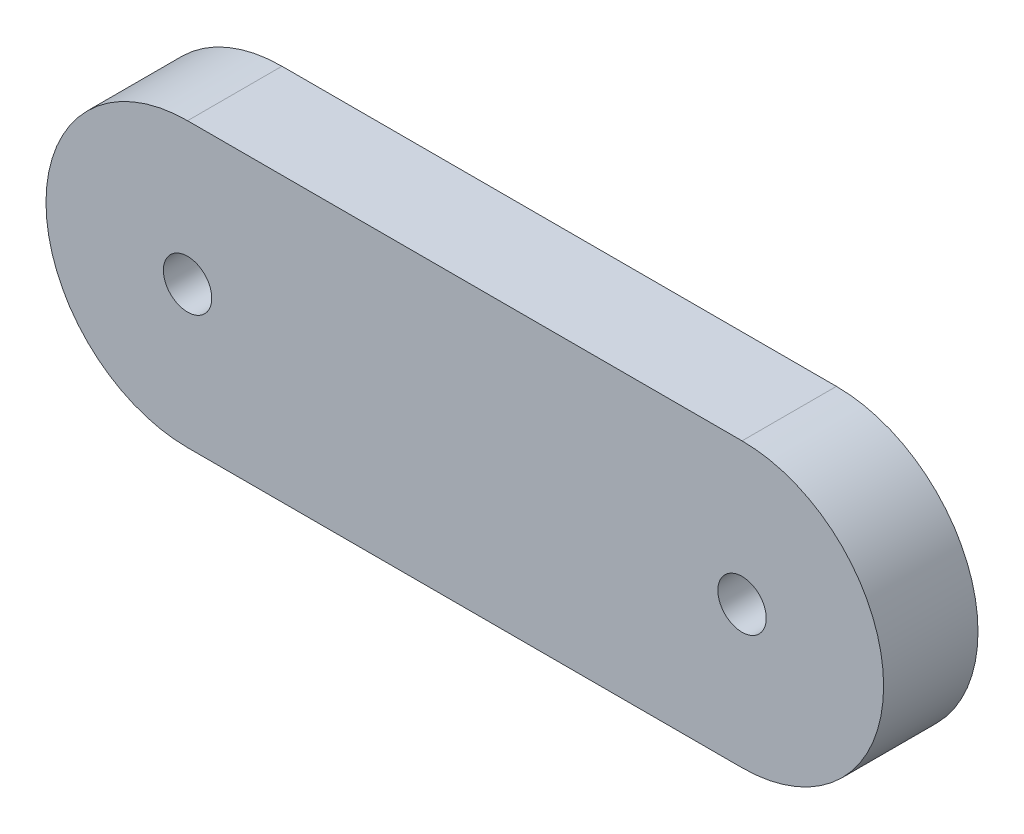
ISO-10303-21;
HEADER;
FILE_DESCRIPTION(('STEP AP214'),'2;1');
FILE_NAME('part.step','',(''),(''),'','','');
FILE_SCHEMA(('AUTOMOTIVE_DESIGN { 1 0 10303 214 1 1 1 1 }'));
ENDSEC;
DATA;
#1=APPLICATION_CONTEXT('core data for automotive mechanical design processes');
#2=APPLICATION_PROTOCOL_DEFINITION('international standard','automotive_design',2000,#1);
#3=PRODUCT_CONTEXT('',#1,'mechanical');
#4=PRODUCT('Part','Part','',(#3));
#5=PRODUCT_RELATED_PRODUCT_CATEGORY('part','',(#4));
#6=PRODUCT_DEFINITION_FORMATION('','',#4);
#7=PRODUCT_DEFINITION_CONTEXT('part definition',#1,'design');
#8=PRODUCT_DEFINITION('design','',#6,#7);
#9=PRODUCT_DEFINITION_SHAPE('','',#8);
#10=(LENGTH_UNIT() NAMED_UNIT(*) SI_UNIT(.MILLI.,.METRE.));
#11=(NAMED_UNIT(*) PLANE_ANGLE_UNIT() SI_UNIT($,.RADIAN.));
#12=(NAMED_UNIT(*) SI_UNIT($,.STERADIAN.) SOLID_ANGLE_UNIT());
#13=UNCERTAINTY_MEASURE_WITH_UNIT(LENGTH_MEASURE(1.E-05),#10,'distance_accuracy_value','');
#14=(GEOMETRIC_REPRESENTATION_CONTEXT(3) GLOBAL_UNCERTAINTY_ASSIGNED_CONTEXT((#13)) GLOBAL_UNIT_ASSIGNED_CONTEXT((#10,
#11,#12)) REPRESENTATION_CONTEXT('',''));
#15=CARTESIAN_POINT('',(0.,0.,0.));
#16=DIRECTION('',(0.,0.,1.));
#17=DIRECTION('',(1.,0.,0.));
#18=AXIS2_PLACEMENT_3D('',#15,#16,#17);
#19=CARTESIAN_POINT('',(-11.8178102416725,0.443484678055133,2.));
#20=DIRECTION('',(0.,0.,-1.));
#21=DIRECTION('',(-1.,0.,0.));
#22=AXIS2_PLACEMENT_3D('',#19,#20,#21);
#23=CYLINDRICAL_SURFACE('',#22,6.);
#24=CARTESIAN_POINT('',(-11.8178102416725,0.443484678055133,-2.));
#25=DIRECTION('',(0.,0.,1.));
#26=DIRECTION('',(1.,0.,0.));
#27=AXIS2_PLACEMENT_3D('',#24,#25,#26);
#28=CIRCLE('',#27,6.);
#29=CARTESIAN_POINT('',(-11.8178102416725,6.44348467805513,-2.));
#30=VERTEX_POINT('',#29);
#31=CARTESIAN_POINT('',(-11.8178102416725,-5.55651532194487,-2.));
#32=VERTEX_POINT('',#31);
#33=EDGE_CURVE('E97',#30,#32,#28,.T.);
#34=ORIENTED_EDGE('',*,*,#33,.T.);
#35=DIRECTION('',(0.,0.,-1.));
#36=VECTOR('',#35,1.);
#37=CARTESIAN_POINT('',(-11.8178102416725,-5.55651532194487,2.));
#38=LINE('',#37,#36);
#39=CARTESIAN_POINT('',(-11.8178102416725,-5.55651532194487,2.));
#40=VERTEX_POINT('',#39);
#41=EDGE_CURVE('E11',#40,#32,#38,.T.);
#42=ORIENTED_EDGE('',*,*,#41,.F.);
#43=CARTESIAN_POINT('',(-11.8178102416725,0.443484678055133,2.));
#44=DIRECTION('',(0.,0.,1.));
#45=DIRECTION('',(1.,0.,0.));
#46=AXIS2_PLACEMENT_3D('',#43,#44,#45);
#47=CIRCLE('',#46,6.);
#48=CARTESIAN_POINT('',(-11.8178102416725,6.44348467805513,2.));
#49=VERTEX_POINT('',#48);
#50=EDGE_CURVE('E85',#49,#40,#47,.T.);
#51=ORIENTED_EDGE('',*,*,#50,.F.);
#52=DIRECTION('',(0.,0.,-1.));
#53=VECTOR('',#52,1.);
#54=CARTESIAN_POINT('',(-11.8178102416725,6.44348467805513,2.));
#55=LINE('',#54,#53);
#56=EDGE_CURVE('E93',#49,#30,#55,.T.);
#57=ORIENTED_EDGE('',*,*,#56,.T.);
#58=EDGE_LOOP('',(#34,#42,#51,#57));
#59=FACE_BOUND('',#58,.T.);
#60=ADVANCED_FACE('F34',(#59),#23,.T.);
#61=CARTESIAN_POINT('',(-11.8178102416725,-5.55651532194487,2.));
#62=DIRECTION('',(0.,1.,0.));
#63=DIRECTION('',(0.,0.,1.));
#64=AXIS2_PLACEMENT_3D('',#61,#62,#63);
#65=PLANE('',#64);
#66=DIRECTION('',(1.,0.,0.));
#67=VECTOR('',#66,1.);
#68=CARTESIAN_POINT('',(-11.8178102416725,-5.55651532194487,-2.));
#69=LINE('',#68,#67);
#70=CARTESIAN_POINT('',(11.6821897583275,-5.55651532194487,-2.));
#71=VERTEX_POINT('',#70);
#72=EDGE_CURVE('E89',#32,#71,#69,.T.);
#73=ORIENTED_EDGE('',*,*,#72,.T.);
#74=DIRECTION('',(0.,0.,-1.));
#75=VECTOR('',#74,1.);
#76=CARTESIAN_POINT('',(11.6821897583275,-5.55651532194487,2.));
#77=LINE('',#76,#75);
#78=CARTESIAN_POINT('',(11.6821897583275,-5.55651532194487,2.));
#79=VERTEX_POINT('',#78);
#80=EDGE_CURVE('E42',#79,#71,#77,.T.);
#81=ORIENTED_EDGE('',*,*,#80,.F.);
#82=DIRECTION('',(1.,0.,0.));
#83=VECTOR('',#82,1.);
#84=CARTESIAN_POINT('',(-11.8178102416725,-5.55651532194487,2.));
#85=LINE('',#84,#83);
#86=EDGE_CURVE('E80',#40,#79,#85,.T.);
#87=ORIENTED_EDGE('',*,*,#86,.F.);
#88=ORIENTED_EDGE('',*,*,#41,.T.);
#89=EDGE_LOOP('',(#73,#81,#87,#88));
#90=FACE_BOUND('',#89,.T.);
#91=ADVANCED_FACE('F88',(#90),#65,.F.);
#92=CARTESIAN_POINT('',(11.6821897583275,0.443484678055133,2.));
#93=DIRECTION('',(0.,0.,-1.));
#94=DIRECTION('',(-1.,0.,0.));
#95=AXIS2_PLACEMENT_3D('',#92,#93,#94);
#96=CYLINDRICAL_SURFACE('',#95,6.);
#97=CARTESIAN_POINT('',(11.6821897583275,0.443484678055133,-2.));
#98=DIRECTION('',(0.,0.,1.));
#99=DIRECTION('',(1.,0.,0.));
#100=AXIS2_PLACEMENT_3D('',#97,#98,#99);
#101=CIRCLE('',#100,6.);
#102=CARTESIAN_POINT('',(11.6821897583275,6.44348467805513,-2.));
#103=VERTEX_POINT('',#102);
#104=EDGE_CURVE('E67',#71,#103,#101,.T.);
#105=ORIENTED_EDGE('',*,*,#104,.T.);
#106=DIRECTION('',(0.,0.,-1.));
#107=VECTOR('',#106,1.);
#108=CARTESIAN_POINT('',(11.6821897583275,6.44348467805513,2.));
#109=LINE('',#108,#107);
#110=CARTESIAN_POINT('',(11.6821897583275,6.44348467805513,2.));
#111=VERTEX_POINT('',#110);
#112=EDGE_CURVE('E90',#111,#103,#109,.T.);
#113=ORIENTED_EDGE('',*,*,#112,.F.);
#114=CARTESIAN_POINT('',(11.6821897583275,0.443484678055133,2.));
#115=DIRECTION('',(0.,0.,1.));
#116=DIRECTION('',(1.,0.,0.));
#117=AXIS2_PLACEMENT_3D('',#114,#115,#116);
#118=CIRCLE('',#117,6.);
#119=EDGE_CURVE('E83',#79,#111,#118,.T.);
#120=ORIENTED_EDGE('',*,*,#119,.F.);
#121=ORIENTED_EDGE('',*,*,#80,.T.);
#122=EDGE_LOOP('',(#105,#113,#120,#121));
#123=FACE_BOUND('',#122,.T.);
#124=ADVANCED_FACE('F91',(#123),#96,.T.);
#125=CARTESIAN_POINT('',(-11.8178102416725,6.44348467805513,2.));
#126=DIRECTION('',(0.,-1.,0.));
#127=DIRECTION('',(0.,0.,-1.));
#128=AXIS2_PLACEMENT_3D('',#125,#126,#127);
#129=PLANE('',#128);
#130=DIRECTION('',(-1.,0.,0.));
#131=VECTOR('',#130,1.);
#132=CARTESIAN_POINT('',(-11.8178102416725,6.44348467805513,-2.));
#133=LINE('',#132,#131);
#134=EDGE_CURVE('E73',#103,#30,#133,.T.);
#135=ORIENTED_EDGE('',*,*,#134,.T.);
#136=ORIENTED_EDGE('',*,*,#56,.F.);
#137=DIRECTION('',(-1.,0.,0.));
#138=VECTOR('',#137,1.);
#139=CARTESIAN_POINT('',(-11.8178102416725,6.44348467805513,2.));
#140=LINE('',#139,#138);
#141=EDGE_CURVE('E50',#111,#49,#140,.T.);
#142=ORIENTED_EDGE('',*,*,#141,.F.);
#143=ORIENTED_EDGE('',*,*,#112,.T.);
#144=EDGE_LOOP('',(#135,#136,#142,#143));
#145=FACE_BOUND('',#144,.T.);
#146=ADVANCED_FACE('F105',(#145),#129,.F.);
#147=CARTESIAN_POINT('',(-11.8178102416725,0.443484678055133,2.));
#148=DIRECTION('',(0.,0.,1.));
#149=DIRECTION('',(1.,0.,0.));
#150=AXIS2_PLACEMENT_3D('',#147,#148,#149);
#151=PLANE('',#150);
#152=CARTESIAN_POINT('',(-11.8178102416725,0.443484678055133,2.));
#153=DIRECTION('',(0.,0.,1.));
#154=DIRECTION('',(1.,0.,0.));
#155=AXIS2_PLACEMENT_3D('',#152,#153,#154);
#156=CIRCLE('',#155,1.02499999999999);
#157=CARTESIAN_POINT('',(-10.7928102416725,0.443484678055133,2.));
#158=VERTEX_POINT('',#157);
#159=EDGE_CURVE('E119',#158,#158,#156,.T.);
#160=ORIENTED_EDGE('',*,*,#159,.F.);
#161=EDGE_LOOP('',(#160));
#162=FACE_BOUND('',#161,.T.);
#163=CARTESIAN_POINT('',(11.6821897583275,0.443484678055133,2.));
#164=DIRECTION('',(0.,0.,1.));
#165=DIRECTION('',(1.,0.,0.));
#166=AXIS2_PLACEMENT_3D('',#163,#164,#165);
#167=CIRCLE('',#166,1.02499999999999);
#168=CARTESIAN_POINT('',(12.7071897583275,0.443484678055133,2.));
#169=VERTEX_POINT('',#168);
#170=EDGE_CURVE('E113',#169,#169,#167,.T.);
#171=ORIENTED_EDGE('',*,*,#170,.F.);
#172=EDGE_LOOP('',(#171));
#173=FACE_BOUND('',#172,.T.);
#174=ORIENTED_EDGE('',*,*,#50,.T.);
#175=ORIENTED_EDGE('',*,*,#86,.T.);
#176=ORIENTED_EDGE('',*,*,#119,.T.);
#177=ORIENTED_EDGE('',*,*,#141,.T.);
#178=EDGE_LOOP('',(#174,#175,#176,#177));
#179=FACE_BOUND('',#178,.T.);
#180=ADVANCED_FACE('F81',(#162,#173,#179),#151,.T.);
#181=CARTESIAN_POINT('',(-11.8178102416725,0.443484678055133,-2.));
#182=DIRECTION('',(0.,0.,1.));
#183=DIRECTION('',(1.,0.,0.));
#184=AXIS2_PLACEMENT_3D('',#181,#182,#183);
#185=PLANE('',#184);
#186=CARTESIAN_POINT('',(-11.8178102416725,0.443484678055133,-2.));
#187=DIRECTION('',(0.,0.,1.));
#188=DIRECTION('',(1.,0.,0.));
#189=AXIS2_PLACEMENT_3D('',#186,#187,#188);
#190=CIRCLE('',#189,1.025);
#191=CARTESIAN_POINT('',(-10.7928102416725,0.443484678055133,-2.));
#192=VERTEX_POINT('',#191);
#193=EDGE_CURVE('E116',#192,#192,#190,.T.);
#194=ORIENTED_EDGE('',*,*,#193,.T.);
#195=EDGE_LOOP('',(#194));
#196=FACE_BOUND('',#195,.T.);
#197=CARTESIAN_POINT('',(11.6821897583275,0.443484678055133,-2.));
#198=DIRECTION('',(0.,0.,1.));
#199=DIRECTION('',(1.,0.,0.));
#200=AXIS2_PLACEMENT_3D('',#197,#198,#199);
#201=CIRCLE('',#200,1.025);
#202=CARTESIAN_POINT('',(12.7071897583275,0.443484678055133,-2.));
#203=VERTEX_POINT('',#202);
#204=EDGE_CURVE('E100',#203,#203,#201,.T.);
#205=ORIENTED_EDGE('',*,*,#204,.T.);
#206=EDGE_LOOP('',(#205));
#207=FACE_BOUND('',#206,.T.);
#208=ORIENTED_EDGE('',*,*,#33,.F.);
#209=ORIENTED_EDGE('',*,*,#134,.F.);
#210=ORIENTED_EDGE('',*,*,#104,.F.);
#211=ORIENTED_EDGE('',*,*,#72,.F.);
#212=EDGE_LOOP('',(#208,#209,#210,#211));
#213=FACE_BOUND('',#212,.T.);
#214=ADVANCED_FACE('F108',(#196,#207,#213),#185,.F.);
#215=CARTESIAN_POINT('',(11.6821897583275,0.443484678055133,2.));
#216=DIRECTION('',(0.,0.,1.));
#217=DIRECTION('',(1.,0.,0.));
#218=AXIS2_PLACEMENT_3D('',#215,#216,#217);
#219=CYLINDRICAL_SURFACE('',#218,1.02499999999999);
#220=ORIENTED_EDGE('',*,*,#204,.F.);
#221=EDGE_LOOP('',(#220));
#222=FACE_BOUND('',#221,.T.);
#223=ORIENTED_EDGE('',*,*,#170,.T.);
#224=EDGE_LOOP('',(#223));
#225=FACE_BOUND('',#224,.T.);
#226=ADVANCED_FACE('F130',(#222,#225),#219,.F.);
#227=CARTESIAN_POINT('',(-11.8178102416725,0.443484678055133,2.));
#228=DIRECTION('',(0.,0.,1.));
#229=DIRECTION('',(1.,0.,0.));
#230=AXIS2_PLACEMENT_3D('',#227,#228,#229);
#231=CYLINDRICAL_SURFACE('',#230,1.02499999999999);
#232=ORIENTED_EDGE('',*,*,#193,.F.);
#233=EDGE_LOOP('',(#232));
#234=FACE_BOUND('',#233,.T.);
#235=ORIENTED_EDGE('',*,*,#159,.T.);
#236=EDGE_LOOP('',(#235));
#237=FACE_BOUND('',#236,.T.);
#238=ADVANCED_FACE('F123',(#234,#237),#231,.F.);
#239=CLOSED_SHELL('',(#60,#91,#124,#146,#180,#214,#226,#238));
#240=MANIFOLD_SOLID_BREP('B2',#239);
#241=ADVANCED_BREP_SHAPE_REPRESENTATION('',(#18,#240),#14);
#242=SHAPE_DEFINITION_REPRESENTATION(#9,#241);
ENDSEC;
END-ISO-10303-21;
